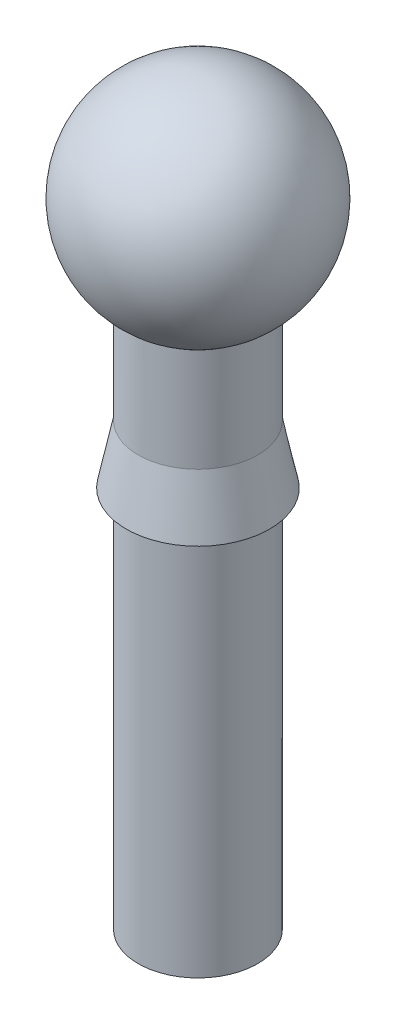
ISO-10303-21;
HEADER;
FILE_DESCRIPTION(('STEP AP214'),'2;1');
FILE_NAME('part.step','',(''),(''),'','','');
FILE_SCHEMA(('AUTOMOTIVE_DESIGN { 1 0 10303 214 1 1 1 1 }'));
ENDSEC;
DATA;
#1=APPLICATION_CONTEXT('core data for automotive mechanical design processes');
#2=APPLICATION_PROTOCOL_DEFINITION('international standard','automotive_design',2000,#1);
#3=PRODUCT_CONTEXT('',#1,'mechanical');
#4=PRODUCT('Part','Part','',(#3));
#5=PRODUCT_RELATED_PRODUCT_CATEGORY('part','',(#4));
#6=PRODUCT_DEFINITION_FORMATION('','',#4);
#7=PRODUCT_DEFINITION_CONTEXT('part definition',#1,'design');
#8=PRODUCT_DEFINITION('design','',#6,#7);
#9=PRODUCT_DEFINITION_SHAPE('','',#8);
#10=(LENGTH_UNIT() NAMED_UNIT(*) SI_UNIT(.MILLI.,.METRE.));
#11=(NAMED_UNIT(*) PLANE_ANGLE_UNIT() SI_UNIT($,.RADIAN.));
#12=(NAMED_UNIT(*) SI_UNIT($,.STERADIAN.) SOLID_ANGLE_UNIT());
#13=UNCERTAINTY_MEASURE_WITH_UNIT(LENGTH_MEASURE(1.E-05),#10,'distance_accuracy_value','');
#14=(GEOMETRIC_REPRESENTATION_CONTEXT(3) GLOBAL_UNCERTAINTY_ASSIGNED_CONTEXT((#13)) GLOBAL_UNIT_ASSIGNED_CONTEXT((#10,
#11,#12)) REPRESENTATION_CONTEXT('',''));
#15=CARTESIAN_POINT('',(0.,0.,0.));
#16=DIRECTION('',(0.,0.,1.));
#17=DIRECTION('',(1.,0.,0.));
#18=AXIS2_PLACEMENT_3D('',#15,#16,#17);
#19=CARTESIAN_POINT('',(0.,26.5,0.));
#20=DIRECTION('',(0.,-1.,0.));
#21=DIRECTION('',(1.,0.,0.));
#22=AXIS2_PLACEMENT_3D('',#19,#20,#21);
#23=SPHERICAL_SURFACE('',#22,4.5);
#24=CARTESIAN_POINT('',(0.,22.7583426132261,0.));
#25=DIRECTION('',(0.,-1.,0.));
#26=DIRECTION('',(0.,0.,-1.));
#27=AXIS2_PLACEMENT_3D('',#24,#25,#26);
#28=CIRCLE('',#27,2.5);
#29=CARTESIAN_POINT('',(0.,22.7583426132261,-2.5));
#30=VERTEX_POINT('',#29);
#31=EDGE_CURVE('E55',#30,#30,#28,.T.);
#32=ORIENTED_EDGE('',*,*,#31,.F.);
#33=EDGE_LOOP('',(#32));
#34=FACE_BOUND('',#33,.T.);
#35=ADVANCED_FACE('F36',(#34),#23,.T.);
#36=CARTESIAN_POINT('',(2.5,0.,0.));
#37=DIRECTION('',(0.,-1.,0.));
#38=DIRECTION('',(0.,0.,-1.));
#39=AXIS2_PLACEMENT_3D('',#36,#37,#38);
#40=PLANE('',#39);
#41=CARTESIAN_POINT('',(0.,0.,0.));
#42=DIRECTION('',(0.,-1.,0.));
#43=DIRECTION('',(0.,0.,-1.));
#44=AXIS2_PLACEMENT_3D('',#41,#42,#43);
#45=CIRCLE('',#44,2.5);
#46=CARTESIAN_POINT('',(0.,0.,-2.5));
#47=VERTEX_POINT('',#46);
#48=EDGE_CURVE('E10',#47,#47,#45,.T.);
#49=ORIENTED_EDGE('',*,*,#48,.T.);
#50=EDGE_LOOP('',(#49));
#51=FACE_BOUND('',#50,.T.);
#52=ADVANCED_FACE('F63',(#51),#40,.T.);
#53=CARTESIAN_POINT('',(0.,0.,0.));
#54=DIRECTION('',(0.,-1.,0.));
#55=DIRECTION('',(0.,0.,-1.));
#56=AXIS2_PLACEMENT_3D('',#53,#54,#55);
#57=CYLINDRICAL_SURFACE('',#56,2.5);
#58=CARTESIAN_POINT('',(0.,16.,0.));
#59=DIRECTION('',(0.,-1.,0.));
#60=DIRECTION('',(0.,0.,-1.));
#61=AXIS2_PLACEMENT_3D('',#58,#59,#60);
#62=CIRCLE('',#61,2.5);
#63=CARTESIAN_POINT('',(0.,16.,-2.5));
#64=VERTEX_POINT('',#63);
#65=EDGE_CURVE('E42',#64,#64,#62,.T.);
#66=ORIENTED_EDGE('',*,*,#65,.T.);
#67=EDGE_LOOP('',(#66));
#68=FACE_BOUND('',#67,.T.);
#69=ORIENTED_EDGE('',*,*,#48,.F.);
#70=EDGE_LOOP('',(#69));
#71=FACE_BOUND('',#70,.T.);
#72=ADVANCED_FACE('F67',(#68,#71),#57,.T.);
#73=CARTESIAN_POINT('',(3.,16.,0.));
#74=DIRECTION('',(0.,-1.,0.));
#75=DIRECTION('',(0.,0.,-1.));
#76=AXIS2_PLACEMENT_3D('',#73,#74,#75);
#77=PLANE('',#76);
#78=CARTESIAN_POINT('',(0.,16.,0.));
#79=DIRECTION('',(0.,-1.,0.));
#80=DIRECTION('',(0.,0.,-1.));
#81=AXIS2_PLACEMENT_3D('',#78,#79,#80);
#82=CIRCLE('',#81,3.);
#83=CARTESIAN_POINT('',(0.,16.,-3.));
#84=VERTEX_POINT('',#83);
#85=EDGE_CURVE('E46',#84,#84,#82,.T.);
#86=ORIENTED_EDGE('',*,*,#85,.T.);
#87=EDGE_LOOP('',(#86));
#88=FACE_BOUND('',#87,.T.);
#89=ORIENTED_EDGE('',*,*,#65,.F.);
#90=EDGE_LOOP('',(#89));
#91=FACE_BOUND('',#90,.T.);
#92=ADVANCED_FACE('F71',(#88,#91),#77,.T.);
#93=CARTESIAN_POINT('',(0.,16.,0.));
#94=DIRECTION('',(0.,-1.,0.));
#95=DIRECTION('',(0.,0.,-1.));
#96=AXIS2_PLACEMENT_3D('',#93,#94,#95);
#97=CONICAL_SURFACE('',#96,3.,0.202540800420703);
#98=CARTESIAN_POINT('',(0.,18.4347889303299,0.));
#99=DIRECTION('',(0.,-1.,0.));
#100=DIRECTION('',(0.,0.,-1.));
#101=AXIS2_PLACEMENT_3D('',#98,#99,#100);
#102=CIRCLE('',#101,2.5);
#103=CARTESIAN_POINT('',(0.,18.4347889303299,-2.5));
#104=VERTEX_POINT('',#103);
#105=EDGE_CURVE('E50',#104,#104,#102,.T.);
#106=ORIENTED_EDGE('',*,*,#105,.T.);
#107=EDGE_LOOP('',(#106));
#108=FACE_BOUND('',#107,.T.);
#109=ORIENTED_EDGE('',*,*,#85,.F.);
#110=EDGE_LOOP('',(#109));
#111=FACE_BOUND('',#110,.T.);
#112=ADVANCED_FACE('F76',(#108,#111),#97,.T.);
#113=CARTESIAN_POINT('',(0.,0.,0.));
#114=DIRECTION('',(0.,-1.,0.));
#115=DIRECTION('',(0.,0.,-1.));
#116=AXIS2_PLACEMENT_3D('',#113,#114,#115);
#117=CYLINDRICAL_SURFACE('',#116,2.5);
#118=ORIENTED_EDGE('',*,*,#31,.T.);
#119=EDGE_LOOP('',(#118));
#120=FACE_BOUND('',#119,.T.);
#121=ORIENTED_EDGE('',*,*,#105,.F.);
#122=EDGE_LOOP('',(#121));
#123=FACE_BOUND('',#122,.T.);
#124=ADVANCED_FACE('F59',(#120,#123),#117,.T.);
#125=CLOSED_SHELL('',(#35,#52,#72,#92,#112,#124));
#126=MANIFOLD_SOLID_BREP('B2',#125);
#127=ADVANCED_BREP_SHAPE_REPRESENTATION('',(#18,#126),#14);
#128=SHAPE_DEFINITION_REPRESENTATION(#9,#127);
ENDSEC;
END-ISO-10303-21;
